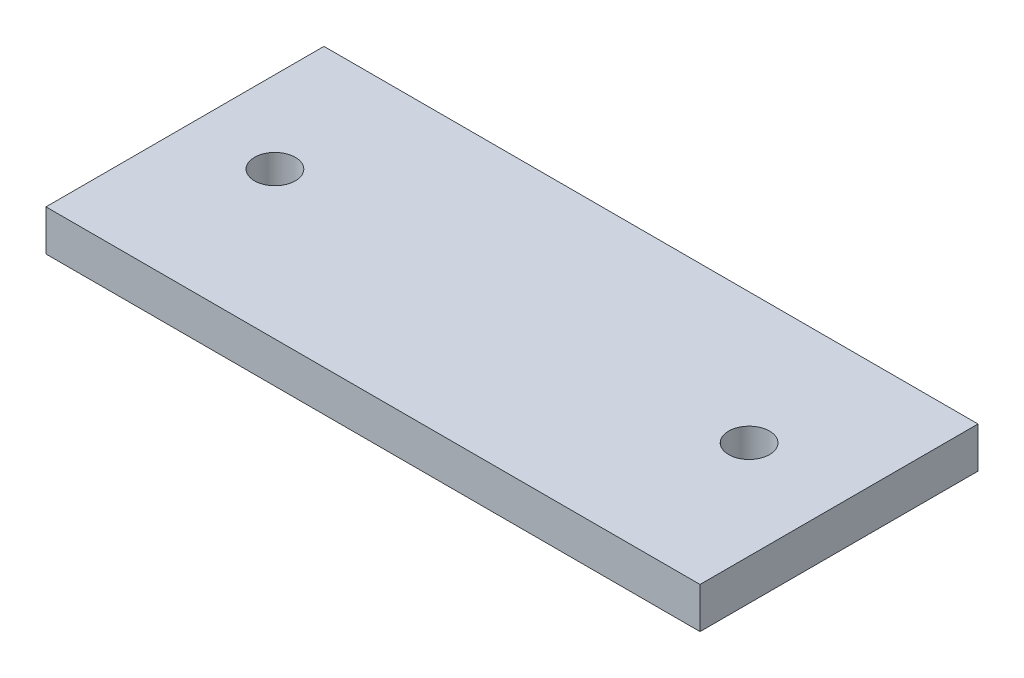
ISO-10303-21;
HEADER;
FILE_DESCRIPTION(('STEP AP214'),'2;1');
FILE_NAME('part.step','',(''),(''),'','','');
FILE_SCHEMA(('AUTOMOTIVE_DESIGN { 1 0 10303 214 1 1 1 1 }'));
ENDSEC;
DATA;
#1=APPLICATION_CONTEXT('core data for automotive mechanical design processes');
#2=APPLICATION_PROTOCOL_DEFINITION('international standard','automotive_design',2000,#1);
#3=PRODUCT_CONTEXT('',#1,'mechanical');
#4=PRODUCT('Part','Part','',(#3));
#5=PRODUCT_RELATED_PRODUCT_CATEGORY('part','',(#4));
#6=PRODUCT_DEFINITION_FORMATION('','',#4);
#7=PRODUCT_DEFINITION_CONTEXT('part definition',#1,'design');
#8=PRODUCT_DEFINITION('design','',#6,#7);
#9=PRODUCT_DEFINITION_SHAPE('','',#8);
#10=(LENGTH_UNIT() NAMED_UNIT(*) SI_UNIT(.MILLI.,.METRE.));
#11=(NAMED_UNIT(*) PLANE_ANGLE_UNIT() SI_UNIT($,.RADIAN.));
#12=(NAMED_UNIT(*) SI_UNIT($,.STERADIAN.) SOLID_ANGLE_UNIT());
#13=UNCERTAINTY_MEASURE_WITH_UNIT(LENGTH_MEASURE(1.E-05),#10,'distance_accuracy_value','');
#14=(GEOMETRIC_REPRESENTATION_CONTEXT(3) GLOBAL_UNCERTAINTY_ASSIGNED_CONTEXT((#13)) GLOBAL_UNIT_ASSIGNED_CONTEXT((#10,
#11,#12)) REPRESENTATION_CONTEXT('',''));
#15=CARTESIAN_POINT('',(0.,0.,0.));
#16=DIRECTION('',(0.,0.,1.));
#17=DIRECTION('',(1.,0.,0.));
#18=AXIS2_PLACEMENT_3D('',#15,#16,#17);
#19=CARTESIAN_POINT('',(0.,3.175,0.));
#20=DIRECTION('',(0.,1.,0.));
#21=DIRECTION('',(0.,0.,1.));
#22=AXIS2_PLACEMENT_3D('',#19,#20,#21);
#23=PLANE('',#22);
#24=CARTESIAN_POINT('',(-19.05,3.175,-0.635000000000002));
#25=DIRECTION('',(0.,1.,0.));
#26=DIRECTION('',(0.,0.,1.));
#27=AXIS2_PLACEMENT_3D('',#24,#25,#26);
#28=CIRCLE('',#27,1.5875);
#29=CARTESIAN_POINT('',(-19.05,3.175,0.952499999999997));
#30=VERTEX_POINT('',#29);
#31=EDGE_CURVE('E112',#30,#30,#28,.T.);
#32=ORIENTED_EDGE('',*,*,#31,.F.);
#33=EDGE_LOOP('',(#32));
#34=FACE_BOUND('',#33,.T.);
#35=DIRECTION('',(0.,0.,-1.));
#36=VECTOR('',#35,1.);
#37=CARTESIAN_POINT('',(25.4,3.175,-10.795));
#38=LINE('',#37,#36);
#39=CARTESIAN_POINT('',(25.4,3.175,10.795));
#40=VERTEX_POINT('',#39);
#41=CARTESIAN_POINT('',(25.4,3.175,-10.795));
#42=VERTEX_POINT('',#41);
#43=EDGE_CURVE('E92',#40,#42,#38,.T.);
#44=ORIENTED_EDGE('',*,*,#43,.T.);
#45=DIRECTION('',(-1.,0.,0.));
#46=VECTOR('',#45,1.);
#47=CARTESIAN_POINT('',(-25.4,3.175,-10.795));
#48=LINE('',#47,#46);
#49=CARTESIAN_POINT('',(-25.4,3.175,-10.795));
#50=VERTEX_POINT('',#49);
#51=EDGE_CURVE('E87',#42,#50,#48,.T.);
#52=ORIENTED_EDGE('',*,*,#51,.T.);
#53=DIRECTION('',(0.,0.,1.));
#54=VECTOR('',#53,1.);
#55=CARTESIAN_POINT('',(-25.4,3.175,-10.795));
#56=LINE('',#55,#54);
#57=CARTESIAN_POINT('',(-25.4,3.175,10.795));
#58=VERTEX_POINT('',#57);
#59=EDGE_CURVE('E90',#50,#58,#56,.T.);
#60=ORIENTED_EDGE('',*,*,#59,.T.);
#61=DIRECTION('',(1.,0.,0.));
#62=VECTOR('',#61,1.);
#63=CARTESIAN_POINT('',(-25.4,3.175,10.795));
#64=LINE('',#63,#62);
#65=EDGE_CURVE('E57',#58,#40,#64,.T.);
#66=ORIENTED_EDGE('',*,*,#65,.T.);
#67=EDGE_LOOP('',(#44,#52,#60,#66));
#68=FACE_BOUND('',#67,.T.);
#69=CARTESIAN_POINT('',(17.78,3.175,-0.635000000000002));
#70=DIRECTION('',(0.,1.,0.));
#71=DIRECTION('',(0.,0.,1.));
#72=AXIS2_PLACEMENT_3D('',#69,#70,#71);
#73=CIRCLE('',#72,1.5875);
#74=CARTESIAN_POINT('',(17.78,3.175,0.952499999999997));
#75=VERTEX_POINT('',#74);
#76=EDGE_CURVE('E134',#75,#75,#73,.T.);
#77=ORIENTED_EDGE('',*,*,#76,.F.);
#78=EDGE_LOOP('',(#77));
#79=FACE_BOUND('',#78,.T.);
#80=ADVANCED_FACE('F39',(#34,#68,#79),#23,.T.);
#81=CARTESIAN_POINT('',(0.,0.,0.));
#82=DIRECTION('',(0.,1.,0.));
#83=DIRECTION('',(0.,0.,1.));
#84=AXIS2_PLACEMENT_3D('',#81,#82,#83);
#85=PLANE('',#84);
#86=DIRECTION('',(0.,0.,-1.));
#87=VECTOR('',#86,1.);
#88=CARTESIAN_POINT('',(25.4,0.,-10.795));
#89=LINE('',#88,#87);
#90=CARTESIAN_POINT('',(25.4,0.,10.795));
#91=VERTEX_POINT('',#90);
#92=CARTESIAN_POINT('',(25.4,0.,-10.795));
#93=VERTEX_POINT('',#92);
#94=EDGE_CURVE('E108',#91,#93,#89,.T.);
#95=ORIENTED_EDGE('',*,*,#94,.F.);
#96=DIRECTION('',(1.,0.,0.));
#97=VECTOR('',#96,1.);
#98=CARTESIAN_POINT('',(-25.4,0.,10.795));
#99=LINE('',#98,#97);
#100=CARTESIAN_POINT('',(-25.4,0.,10.795));
#101=VERTEX_POINT('',#100);
#102=EDGE_CURVE('E80',#101,#91,#99,.T.);
#103=ORIENTED_EDGE('',*,*,#102,.F.);
#104=DIRECTION('',(0.,0.,1.));
#105=VECTOR('',#104,1.);
#106=CARTESIAN_POINT('',(-25.4,0.,-10.795));
#107=LINE('',#106,#105);
#108=CARTESIAN_POINT('',(-25.4,0.,-10.795));
#109=VERTEX_POINT('',#108);
#110=EDGE_CURVE('E74',#109,#101,#107,.T.);
#111=ORIENTED_EDGE('',*,*,#110,.F.);
#112=DIRECTION('',(-1.,0.,0.));
#113=VECTOR('',#112,1.);
#114=CARTESIAN_POINT('',(-25.4,0.,-10.795));
#115=LINE('',#114,#113);
#116=EDGE_CURVE('E97',#93,#109,#115,.T.);
#117=ORIENTED_EDGE('',*,*,#116,.F.);
#118=EDGE_LOOP('',(#95,#103,#111,#117));
#119=FACE_BOUND('',#118,.T.);
#120=CARTESIAN_POINT('',(-19.05,0.,-0.635000000000002));
#121=DIRECTION('',(0.,1.,0.));
#122=DIRECTION('',(0.,0.,1.));
#123=AXIS2_PLACEMENT_3D('',#120,#121,#122);
#124=CIRCLE('',#123,1.5875);
#125=CARTESIAN_POINT('',(-19.05,0.,0.952499999999997));
#126=VERTEX_POINT('',#125);
#127=EDGE_CURVE('E130',#126,#126,#124,.T.);
#128=ORIENTED_EDGE('',*,*,#127,.T.);
#129=EDGE_LOOP('',(#128));
#130=FACE_BOUND('',#129,.T.);
#131=CARTESIAN_POINT('',(17.78,0.,-0.635000000000002));
#132=DIRECTION('',(0.,1.,0.));
#133=DIRECTION('',(0.,0.,1.));
#134=AXIS2_PLACEMENT_3D('',#131,#132,#133);
#135=CIRCLE('',#134,1.5875);
#136=CARTESIAN_POINT('',(17.78,0.,0.952499999999997));
#137=VERTEX_POINT('',#136);
#138=EDGE_CURVE('E138',#137,#137,#135,.T.);
#139=ORIENTED_EDGE('',*,*,#138,.T.);
#140=EDGE_LOOP('',(#139));
#141=FACE_BOUND('',#140,.T.);
#142=ADVANCED_FACE('F125',(#119,#130,#141),#85,.F.);
#143=CARTESIAN_POINT('',(25.4,3.175,-10.795));
#144=DIRECTION('',(-1.,0.,0.));
#145=DIRECTION('',(0.,0.,1.));
#146=AXIS2_PLACEMENT_3D('',#143,#144,#145);
#147=PLANE('',#146);
#148=ORIENTED_EDGE('',*,*,#94,.T.);
#149=DIRECTION('',(0.,-1.,0.));
#150=VECTOR('',#149,1.);
#151=CARTESIAN_POINT('',(25.4,3.175,-10.795));
#152=LINE('',#151,#150);
#153=EDGE_CURVE('E11',#42,#93,#152,.T.);
#154=ORIENTED_EDGE('',*,*,#153,.F.);
#155=ORIENTED_EDGE('',*,*,#43,.F.);
#156=DIRECTION('',(0.,-1.,0.));
#157=VECTOR('',#156,1.);
#158=CARTESIAN_POINT('',(25.4,3.175,10.795));
#159=LINE('',#158,#157);
#160=EDGE_CURVE('E104',#40,#91,#159,.T.);
#161=ORIENTED_EDGE('',*,*,#160,.T.);
#162=EDGE_LOOP('',(#148,#154,#155,#161));
#163=FACE_BOUND('',#162,.T.);
#164=ADVANCED_FACE('F41',(#163),#147,.F.);
#165=CARTESIAN_POINT('',(-25.4,3.175,-10.795));
#166=DIRECTION('',(0.,0.,1.));
#167=DIRECTION('',(1.,0.,0.));
#168=AXIS2_PLACEMENT_3D('',#165,#166,#167);
#169=PLANE('',#168);
#170=ORIENTED_EDGE('',*,*,#116,.T.);
#171=DIRECTION('',(0.,-1.,0.));
#172=VECTOR('',#171,1.);
#173=CARTESIAN_POINT('',(-25.4,3.175,-10.795));
#174=LINE('',#173,#172);
#175=EDGE_CURVE('E49',#50,#109,#174,.T.);
#176=ORIENTED_EDGE('',*,*,#175,.F.);
#177=ORIENTED_EDGE('',*,*,#51,.F.);
#178=ORIENTED_EDGE('',*,*,#153,.T.);
#179=EDGE_LOOP('',(#170,#176,#177,#178));
#180=FACE_BOUND('',#179,.T.);
#181=ADVANCED_FACE('F96',(#180),#169,.F.);
#182=CARTESIAN_POINT('',(-25.4,3.175,-10.795));
#183=DIRECTION('',(1.,0.,0.));
#184=DIRECTION('',(0.,0.,-1.));
#185=AXIS2_PLACEMENT_3D('',#182,#183,#184);
#186=PLANE('',#185);
#187=ORIENTED_EDGE('',*,*,#110,.T.);
#188=DIRECTION('',(0.,-1.,0.));
#189=VECTOR('',#188,1.);
#190=CARTESIAN_POINT('',(-25.4,3.175,10.795));
#191=LINE('',#190,#189);
#192=EDGE_CURVE('E99',#58,#101,#191,.T.);
#193=ORIENTED_EDGE('',*,*,#192,.F.);
#194=ORIENTED_EDGE('',*,*,#59,.F.);
#195=ORIENTED_EDGE('',*,*,#175,.T.);
#196=EDGE_LOOP('',(#187,#193,#194,#195));
#197=FACE_BOUND('',#196,.T.);
#198=ADVANCED_FACE('F100',(#197),#186,.F.);
#199=CARTESIAN_POINT('',(-25.4,3.175,10.795));
#200=DIRECTION('',(0.,0.,-1.));
#201=DIRECTION('',(-1.,0.,0.));
#202=AXIS2_PLACEMENT_3D('',#199,#200,#201);
#203=PLANE('',#202);
#204=ORIENTED_EDGE('',*,*,#102,.T.);
#205=ORIENTED_EDGE('',*,*,#160,.F.);
#206=ORIENTED_EDGE('',*,*,#65,.F.);
#207=ORIENTED_EDGE('',*,*,#192,.T.);
#208=EDGE_LOOP('',(#204,#205,#206,#207));
#209=FACE_BOUND('',#208,.T.);
#210=ADVANCED_FACE('F122',(#209),#203,.F.);
#211=CARTESIAN_POINT('',(-19.05,3.175,-0.635000000000002));
#212=DIRECTION('',(0.,-1.,0.));
#213=DIRECTION('',(0.,0.,-1.));
#214=AXIS2_PLACEMENT_3D('',#211,#212,#213);
#215=CYLINDRICAL_SURFACE('',#214,1.5875);
#216=ORIENTED_EDGE('',*,*,#31,.T.);
#217=EDGE_LOOP('',(#216));
#218=FACE_BOUND('',#217,.T.);
#219=ORIENTED_EDGE('',*,*,#127,.F.);
#220=EDGE_LOOP('',(#219));
#221=FACE_BOUND('',#220,.T.);
#222=ADVANCED_FACE('F157',(#218,#221),#215,.F.);
#223=CARTESIAN_POINT('',(17.78,3.175,-0.635000000000002));
#224=DIRECTION('',(0.,-1.,0.));
#225=DIRECTION('',(0.,0.,-1.));
#226=AXIS2_PLACEMENT_3D('',#223,#224,#225);
#227=CYLINDRICAL_SURFACE('',#226,1.5875);
#228=ORIENTED_EDGE('',*,*,#76,.T.);
#229=EDGE_LOOP('',(#228));
#230=FACE_BOUND('',#229,.T.);
#231=ORIENTED_EDGE('',*,*,#138,.F.);
#232=EDGE_LOOP('',(#231));
#233=FACE_BOUND('',#232,.T.);
#234=ADVANCED_FACE('F146',(#230,#233),#227,.F.);
#235=CLOSED_SHELL('',(#80,#142,#164,#181,#198,#210,#222,#234));
#236=MANIFOLD_SOLID_BREP('B2',#235);
#237=ADVANCED_BREP_SHAPE_REPRESENTATION('',(#18,#236),#14);
#238=SHAPE_DEFINITION_REPRESENTATION(#9,#237);
ENDSEC;
END-ISO-10303-21;
